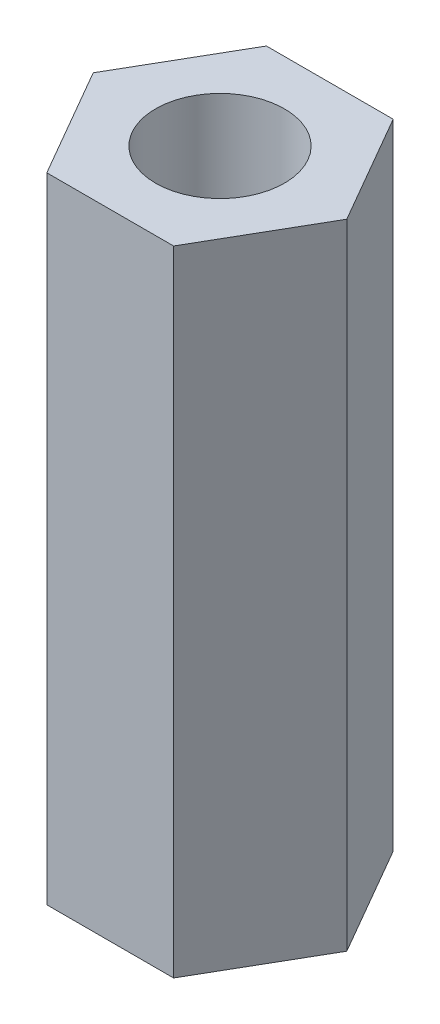
ISO-10303-21;
HEADER;
FILE_DESCRIPTION(('STEP AP214'),'2;1');
FILE_NAME('part.step','',(''),(''),'','','');
FILE_SCHEMA(('AUTOMOTIVE_DESIGN { 1 0 10303 214 1 1 1 1 }'));
ENDSEC;
DATA;
#1=APPLICATION_CONTEXT('core data for automotive mechanical design processes');
#2=APPLICATION_PROTOCOL_DEFINITION('international standard','automotive_design',2000,#1);
#3=PRODUCT_CONTEXT('',#1,'mechanical');
#4=PRODUCT('Part','Part','',(#3));
#5=PRODUCT_RELATED_PRODUCT_CATEGORY('part','',(#4));
#6=PRODUCT_DEFINITION_FORMATION('','',#4);
#7=PRODUCT_DEFINITION_CONTEXT('part definition',#1,'design');
#8=PRODUCT_DEFINITION('design','',#6,#7);
#9=PRODUCT_DEFINITION_SHAPE('','',#8);
#10=(LENGTH_UNIT() NAMED_UNIT(*) SI_UNIT(.MILLI.,.METRE.));
#11=(NAMED_UNIT(*) PLANE_ANGLE_UNIT() SI_UNIT($,.RADIAN.));
#12=(NAMED_UNIT(*) SI_UNIT($,.STERADIAN.) SOLID_ANGLE_UNIT());
#13=UNCERTAINTY_MEASURE_WITH_UNIT(LENGTH_MEASURE(1.E-05),#10,'distance_accuracy_value','');
#14=(GEOMETRIC_REPRESENTATION_CONTEXT(3) GLOBAL_UNCERTAINTY_ASSIGNED_CONTEXT((#13)) GLOBAL_UNIT_ASSIGNED_CONTEXT((#10,
#11,#12)) REPRESENTATION_CONTEXT('',''));
#15=CARTESIAN_POINT('',(0.,0.,0.));
#16=DIRECTION('',(0.,0.,1.));
#17=DIRECTION('',(1.,0.,0.));
#18=AXIS2_PLACEMENT_3D('',#15,#16,#17);
#19=CARTESIAN_POINT('',(1.50000000000003,15.,2.5980762113533));
#20=DIRECTION('',(-0.866025403784441,0.,-0.499999999999995));
#21=DIRECTION('',(-0.499999999999995,0.,0.866025403784442));
#22=AXIS2_PLACEMENT_3D('',#19,#20,#21);
#23=PLANE('',#22);
#24=DIRECTION('',(0.499999999999995,0.,-0.866025403784442));
#25=VECTOR('',#24,1.);
#26=CARTESIAN_POINT('',(1.50000000000003,0.,2.5980762113533));
#27=LINE('',#26,#25);
#28=CARTESIAN_POINT('',(1.50000000000003,0.,2.5980762113533));
#29=VERTEX_POINT('',#28);
#30=CARTESIAN_POINT('',(3.,0.,0.));
#31=VERTEX_POINT('',#30);
#32=EDGE_CURVE('E117',#29,#31,#27,.T.);
#33=ORIENTED_EDGE('',*,*,#32,.T.);
#34=DIRECTION('',(0.,-1.,0.));
#35=VECTOR('',#34,1.);
#36=CARTESIAN_POINT('',(3.,15.,0.));
#37=LINE('',#36,#35);
#38=CARTESIAN_POINT('',(3.,15.,0.));
#39=VERTEX_POINT('',#38);
#40=EDGE_CURVE('E11',#39,#31,#37,.T.);
#41=ORIENTED_EDGE('',*,*,#40,.F.);
#42=DIRECTION('',(0.499999999999995,0.,-0.866025403784442));
#43=VECTOR('',#42,1.);
#44=CARTESIAN_POINT('',(1.50000000000003,15.,2.5980762113533));
#45=LINE('',#44,#43);
#46=CARTESIAN_POINT('',(1.50000000000003,15.,2.5980762113533));
#47=VERTEX_POINT('',#46);
#48=EDGE_CURVE('E128',#47,#39,#45,.T.);
#49=ORIENTED_EDGE('',*,*,#48,.F.);
#50=DIRECTION('',(0.,-1.,0.));
#51=VECTOR('',#50,1.);
#52=CARTESIAN_POINT('',(1.50000000000003,15.,2.5980762113533));
#53=LINE('',#52,#51);
#54=EDGE_CURVE('E113',#47,#29,#53,.T.);
#55=ORIENTED_EDGE('',*,*,#54,.T.);
#56=EDGE_LOOP('',(#33,#41,#49,#55));
#57=FACE_BOUND('',#56,.T.);
#58=ADVANCED_FACE('F33',(#57),#23,.F.);
#59=CARTESIAN_POINT('',(3.,15.,0.));
#60=DIRECTION('',(-0.866025403784438,0.,0.500000000000001));
#61=DIRECTION('',(0.500000000000001,0.,0.866025403784438));
#62=AXIS2_PLACEMENT_3D('',#59,#60,#61);
#63=PLANE('',#62);
#64=DIRECTION('',(-0.500000000000001,0.,-0.866025403784438));
#65=VECTOR('',#64,1.);
#66=CARTESIAN_POINT('',(3.,0.,0.));
#67=LINE('',#66,#65);
#68=CARTESIAN_POINT('',(1.49999999999999,0.,-2.59807621135332));
#69=VERTEX_POINT('',#68);
#70=EDGE_CURVE('E120',#31,#69,#67,.T.);
#71=ORIENTED_EDGE('',*,*,#70,.T.);
#72=DIRECTION('',(0.,-1.,0.));
#73=VECTOR('',#72,1.);
#74=CARTESIAN_POINT('',(1.49999999999999,15.,-2.59807621135332));
#75=LINE('',#74,#73);
#76=CARTESIAN_POINT('',(1.49999999999999,15.,-2.59807621135332));
#77=VERTEX_POINT('',#76);
#78=EDGE_CURVE('E41',#77,#69,#75,.T.);
#79=ORIENTED_EDGE('',*,*,#78,.F.);
#80=DIRECTION('',(-0.500000000000001,0.,-0.866025403784438));
#81=VECTOR('',#80,1.);
#82=CARTESIAN_POINT('',(3.,15.,0.));
#83=LINE('',#82,#81);
#84=EDGE_CURVE('E86',#39,#77,#83,.T.);
#85=ORIENTED_EDGE('',*,*,#84,.F.);
#86=ORIENTED_EDGE('',*,*,#40,.T.);
#87=EDGE_LOOP('',(#71,#79,#85,#86));
#88=FACE_BOUND('',#87,.T.);
#89=ADVANCED_FACE('F153',(#88),#63,.F.);
#90=CARTESIAN_POINT('',(1.49999999999999,15.,-2.59807621135332));
#91=DIRECTION('',(0.,0.,1.));
#92=DIRECTION('',(1.,0.,0.));
#93=AXIS2_PLACEMENT_3D('',#90,#91,#92);
#94=PLANE('',#93);
#95=DIRECTION('',(-1.,0.,0.));
#96=VECTOR('',#95,1.);
#97=CARTESIAN_POINT('',(1.49999999999999,0.,-2.59807621135332));
#98=LINE('',#97,#96);
#99=CARTESIAN_POINT('',(-1.50000000000001,0.,-2.59807621135331));
#100=VERTEX_POINT('',#99);
#101=EDGE_CURVE('E123',#69,#100,#98,.T.);
#102=ORIENTED_EDGE('',*,*,#101,.T.);
#103=DIRECTION('',(0.,-1.,0.));
#104=VECTOR('',#103,1.);
#105=CARTESIAN_POINT('',(-1.50000000000001,15.,-2.59807621135331));
#106=LINE('',#105,#104);
#107=CARTESIAN_POINT('',(-1.50000000000001,15.,-2.59807621135331));
#108=VERTEX_POINT('',#107);
#109=EDGE_CURVE('E108',#108,#100,#106,.T.);
#110=ORIENTED_EDGE('',*,*,#109,.F.);
#111=DIRECTION('',(-1.,0.,0.));
#112=VECTOR('',#111,1.);
#113=CARTESIAN_POINT('',(1.49999999999999,15.,-2.59807621135332));
#114=LINE('',#113,#112);
#115=EDGE_CURVE('E99',#77,#108,#114,.T.);
#116=ORIENTED_EDGE('',*,*,#115,.F.);
#117=ORIENTED_EDGE('',*,*,#78,.T.);
#118=EDGE_LOOP('',(#102,#110,#116,#117));
#119=FACE_BOUND('',#118,.T.);
#120=ADVANCED_FACE('F134',(#119),#94,.F.);
#121=CARTESIAN_POINT('',(-1.50000000000001,15.,-2.59807621135331));
#122=DIRECTION('',(0.866025403784441,0.,0.499999999999995));
#123=DIRECTION('',(0.499999999999995,0.,-0.866025403784441));
#124=AXIS2_PLACEMENT_3D('',#121,#122,#123);
#125=PLANE('',#124);
#126=DIRECTION('',(-0.499999999999995,0.,0.866025403784441));
#127=VECTOR('',#126,1.);
#128=CARTESIAN_POINT('',(-1.50000000000001,0.,-2.59807621135331));
#129=LINE('',#128,#127);
#130=CARTESIAN_POINT('',(-3.,0.,0.));
#131=VERTEX_POINT('',#130);
#132=EDGE_CURVE('E107',#100,#131,#129,.T.);
#133=ORIENTED_EDGE('',*,*,#132,.T.);
#134=DIRECTION('',(0.,-1.,0.));
#135=VECTOR('',#134,1.);
#136=CARTESIAN_POINT('',(-3.,15.,0.));
#137=LINE('',#136,#135);
#138=CARTESIAN_POINT('',(-3.,15.,0.));
#139=VERTEX_POINT('',#138);
#140=EDGE_CURVE('E104',#139,#131,#137,.T.);
#141=ORIENTED_EDGE('',*,*,#140,.F.);
#142=DIRECTION('',(-0.499999999999995,0.,0.866025403784441));
#143=VECTOR('',#142,1.);
#144=CARTESIAN_POINT('',(-1.50000000000001,15.,-2.59807621135331));
#145=LINE('',#144,#143);
#146=EDGE_CURVE('E93',#108,#139,#145,.T.);
#147=ORIENTED_EDGE('',*,*,#146,.F.);
#148=ORIENTED_EDGE('',*,*,#109,.T.);
#149=EDGE_LOOP('',(#133,#141,#147,#148));
#150=FACE_BOUND('',#149,.T.);
#151=ADVANCED_FACE('F105',(#150),#125,.F.);
#152=CARTESIAN_POINT('',(-3.,15.,0.));
#153=DIRECTION('',(0.866025403784435,0.,-0.500000000000007));
#154=DIRECTION('',(-0.500000000000007,0.,-0.866025403784435));
#155=AXIS2_PLACEMENT_3D('',#152,#153,#154);
#156=PLANE('',#155);
#157=DIRECTION('',(0.500000000000007,0.,0.866025403784434));
#158=VECTOR('',#157,1.);
#159=CARTESIAN_POINT('',(-3.,0.,0.));
#160=LINE('',#159,#158);
#161=CARTESIAN_POINT('',(-1.49999999999998,0.,2.59807621135333));
#162=VERTEX_POINT('',#161);
#163=EDGE_CURVE('E72',#131,#162,#160,.T.);
#164=ORIENTED_EDGE('',*,*,#163,.T.);
#165=DIRECTION('',(0.,-1.,0.));
#166=VECTOR('',#165,1.);
#167=CARTESIAN_POINT('',(-1.49999999999998,15.,2.59807621135333));
#168=LINE('',#167,#166);
#169=CARTESIAN_POINT('',(-1.49999999999998,15.,2.59807621135333));
#170=VERTEX_POINT('',#169);
#171=EDGE_CURVE('E109',#170,#162,#168,.T.);
#172=ORIENTED_EDGE('',*,*,#171,.F.);
#173=DIRECTION('',(0.500000000000007,0.,0.866025403784434));
#174=VECTOR('',#173,1.);
#175=CARTESIAN_POINT('',(-3.,15.,0.));
#176=LINE('',#175,#174);
#177=EDGE_CURVE('E97',#139,#170,#176,.T.);
#178=ORIENTED_EDGE('',*,*,#177,.F.);
#179=ORIENTED_EDGE('',*,*,#140,.T.);
#180=EDGE_LOOP('',(#164,#172,#178,#179));
#181=FACE_BOUND('',#180,.T.);
#182=ADVANCED_FACE('F111',(#181),#156,.F.);
#183=CARTESIAN_POINT('',(-1.49999999999998,15.,2.59807621135333));
#184=DIRECTION('',(0.,0.,-1.));
#185=DIRECTION('',(-1.,0.,0.));
#186=AXIS2_PLACEMENT_3D('',#183,#184,#185);
#187=PLANE('',#186);
#188=DIRECTION('',(1.,0.,0.));
#189=VECTOR('',#188,1.);
#190=CARTESIAN_POINT('',(-1.49999999999998,0.,2.59807621135333));
#191=LINE('',#190,#189);
#192=EDGE_CURVE('E78',#162,#29,#191,.T.);
#193=ORIENTED_EDGE('',*,*,#192,.T.);
#194=ORIENTED_EDGE('',*,*,#54,.F.);
#195=DIRECTION('',(1.,0.,0.));
#196=VECTOR('',#195,1.);
#197=CARTESIAN_POINT('',(-1.49999999999998,15.,2.59807621135333));
#198=LINE('',#197,#196);
#199=EDGE_CURVE('E49',#170,#47,#198,.T.);
#200=ORIENTED_EDGE('',*,*,#199,.F.);
#201=ORIENTED_EDGE('',*,*,#171,.T.);
#202=EDGE_LOOP('',(#193,#194,#200,#201));
#203=FACE_BOUND('',#202,.T.);
#204=ADVANCED_FACE('F141',(#203),#187,.F.);
#205=CARTESIAN_POINT('',(0.,15.,0.));
#206=DIRECTION('',(0.,1.,0.));
#207=DIRECTION('',(0.,0.,1.));
#208=AXIS2_PLACEMENT_3D('',#205,#206,#207);
#209=PLANE('',#208);
#210=CARTESIAN_POINT('',(0.,15.,0.));
#211=DIRECTION('',(0.,1.,0.));
#212=DIRECTION('',(0.,0.,1.));
#213=AXIS2_PLACEMENT_3D('',#210,#211,#212);
#214=CIRCLE('',#213,1.525);
#215=CARTESIAN_POINT('',(0.,15.,1.525));
#216=VERTEX_POINT('',#215);
#217=EDGE_CURVE('E208',#216,#216,#214,.T.);
#218=ORIENTED_EDGE('',*,*,#217,.F.);
#219=EDGE_LOOP('',(#218));
#220=FACE_BOUND('',#219,.T.);
#221=ORIENTED_EDGE('',*,*,#48,.T.);
#222=ORIENTED_EDGE('',*,*,#84,.T.);
#223=ORIENTED_EDGE('',*,*,#115,.T.);
#224=ORIENTED_EDGE('',*,*,#146,.T.);
#225=ORIENTED_EDGE('',*,*,#177,.T.);
#226=ORIENTED_EDGE('',*,*,#199,.T.);
#227=EDGE_LOOP('',(#221,#222,#223,#224,#225,#226));
#228=FACE_BOUND('',#227,.T.);
#229=ADVANCED_FACE('F95',(#220,#228),#209,.T.);
#230=CARTESIAN_POINT('',(0.,0.,0.));
#231=DIRECTION('',(0.,1.,0.));
#232=DIRECTION('',(0.,0.,1.));
#233=AXIS2_PLACEMENT_3D('',#230,#231,#232);
#234=PLANE('',#233);
#235=CARTESIAN_POINT('',(0.,0.,0.));
#236=DIRECTION('',(0.,1.,0.));
#237=DIRECTION('',(0.,0.,1.));
#238=AXIS2_PLACEMENT_3D('',#235,#236,#237);
#239=CIRCLE('',#238,1.525);
#240=CARTESIAN_POINT('',(0.,0.,1.525));
#241=VERTEX_POINT('',#240);
#242=EDGE_CURVE('E121',#241,#241,#239,.T.);
#243=ORIENTED_EDGE('',*,*,#242,.T.);
#244=EDGE_LOOP('',(#243));
#245=FACE_BOUND('',#244,.T.);
#246=ORIENTED_EDGE('',*,*,#32,.F.);
#247=ORIENTED_EDGE('',*,*,#192,.F.);
#248=ORIENTED_EDGE('',*,*,#163,.F.);
#249=ORIENTED_EDGE('',*,*,#132,.F.);
#250=ORIENTED_EDGE('',*,*,#101,.F.);
#251=ORIENTED_EDGE('',*,*,#70,.F.);
#252=EDGE_LOOP('',(#246,#247,#248,#249,#250,#251));
#253=FACE_BOUND('',#252,.T.);
#254=ADVANCED_FACE('F137',(#245,#253),#234,.F.);
#255=CARTESIAN_POINT('',(0.,0.,0.));
#256=DIRECTION('',(0.,1.,0.));
#257=DIRECTION('',(0.,0.,1.));
#258=AXIS2_PLACEMENT_3D('',#255,#256,#257);
#259=CYLINDRICAL_SURFACE('',#258,1.525);
#260=ORIENTED_EDGE('',*,*,#242,.F.);
#261=EDGE_LOOP('',(#260));
#262=FACE_BOUND('',#261,.T.);
#263=ORIENTED_EDGE('',*,*,#217,.T.);
#264=EDGE_LOOP('',(#263));
#265=FACE_BOUND('',#264,.T.);
#266=ADVANCED_FACE('F190',(#262,#265),#259,.F.);
#267=CLOSED_SHELL('',(#58,#89,#120,#151,#182,#204,#229,#254,#266));
#268=MANIFOLD_SOLID_BREP('B2',#267);
#269=ADVANCED_BREP_SHAPE_REPRESENTATION('',(#18,#268),#14);
#270=SHAPE_DEFINITION_REPRESENTATION(#9,#269);
ENDSEC;
END-ISO-10303-21;
